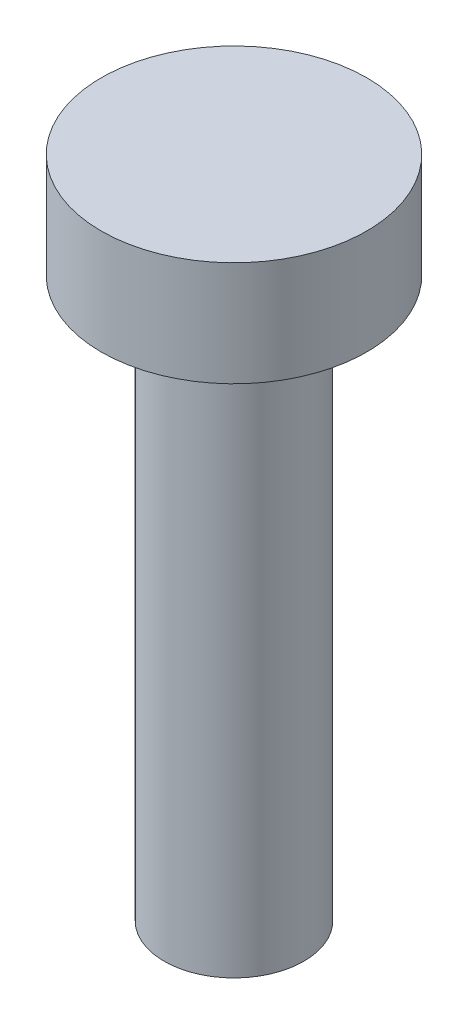
ISO-10303-21;
HEADER;
FILE_DESCRIPTION(('STEP AP214'),'2;1');
FILE_NAME('part.step','',(''),(''),'','','');
FILE_SCHEMA(('AUTOMOTIVE_DESIGN { 1 0 10303 214 1 1 1 1 }'));
ENDSEC;
DATA;
#1=APPLICATION_CONTEXT('core data for automotive mechanical design processes');
#2=APPLICATION_PROTOCOL_DEFINITION('international standard','automotive_design',2000,#1);
#3=PRODUCT_CONTEXT('',#1,'mechanical');
#4=PRODUCT('Part','Part','',(#3));
#5=PRODUCT_RELATED_PRODUCT_CATEGORY('part','',(#4));
#6=PRODUCT_DEFINITION_FORMATION('','',#4);
#7=PRODUCT_DEFINITION_CONTEXT('part definition',#1,'design');
#8=PRODUCT_DEFINITION('design','',#6,#7);
#9=PRODUCT_DEFINITION_SHAPE('','',#8);
#10=(LENGTH_UNIT() NAMED_UNIT(*) SI_UNIT(.MILLI.,.METRE.));
#11=(NAMED_UNIT(*) PLANE_ANGLE_UNIT() SI_UNIT($,.RADIAN.));
#12=(NAMED_UNIT(*) SI_UNIT($,.STERADIAN.) SOLID_ANGLE_UNIT());
#13=UNCERTAINTY_MEASURE_WITH_UNIT(LENGTH_MEASURE(1.E-05),#10,'distance_accuracy_value','');
#14=(GEOMETRIC_REPRESENTATION_CONTEXT(3) GLOBAL_UNCERTAINTY_ASSIGNED_CONTEXT((#13)) GLOBAL_UNIT_ASSIGNED_CONTEXT((#10,
#11,#12)) REPRESENTATION_CONTEXT('',''));
#15=CARTESIAN_POINT('',(0.,0.,0.));
#16=DIRECTION('',(0.,0.,1.));
#17=DIRECTION('',(1.,0.,0.));
#18=AXIS2_PLACEMENT_3D('',#15,#16,#17);
#19=CARTESIAN_POINT('',(117.,149.,-159.));
#20=DIRECTION('',(0.,-1.,0.));
#21=DIRECTION('',(0.,0.,1.));
#22=AXIS2_PLACEMENT_3D('',#19,#20,#21);
#23=PLANE('',#22);
#24=CARTESIAN_POINT('',(117.,149.,-159.));
#25=DIRECTION('',(0.,-1.,0.));
#26=DIRECTION('',(0.,0.,-1.));
#27=AXIS2_PLACEMENT_3D('',#24,#25,#26);
#28=CIRCLE('',#27,5.);
#29=CARTESIAN_POINT('',(117.,149.,-164.));
#30=VERTEX_POINT('',#29);
#31=EDGE_CURVE('E10',#30,#30,#28,.T.);
#32=ORIENTED_EDGE('',*,*,#31,.F.);
#33=EDGE_LOOP('',(#32));
#34=FACE_BOUND('',#33,.T.);
#35=CARTESIAN_POINT('',(117.,149.,-159.));
#36=DIRECTION('',(0.,1.,0.));
#37=DIRECTION('',(0.,0.,-1.));
#38=AXIS2_PLACEMENT_3D('',#35,#36,#37);
#39=CIRCLE('',#38,9.5);
#40=CARTESIAN_POINT('',(117.,149.,-168.5));
#41=VERTEX_POINT('',#40);
#42=EDGE_CURVE('E33',#41,#41,#39,.T.);
#43=ORIENTED_EDGE('',*,*,#42,.F.);
#44=EDGE_LOOP('',(#43));
#45=FACE_BOUND('',#44,.T.);
#46=ADVANCED_FACE('F15',(#34,#45),#23,.T.);
#47=CARTESIAN_POINT('',(117.,106.625,-159.));
#48=DIRECTION('',(0.,1.,0.));
#49=DIRECTION('',(0.,0.,1.));
#50=AXIS2_PLACEMENT_3D('',#47,#48,#49);
#51=CYLINDRICAL_SURFACE('',#50,9.5);
#52=CARTESIAN_POINT('',(117.,156.5,-159.));
#53=DIRECTION('',(0.,1.,0.));
#54=DIRECTION('',(0.,0.,-1.));
#55=AXIS2_PLACEMENT_3D('',#52,#53,#54);
#56=CIRCLE('',#55,9.5);
#57=CARTESIAN_POINT('',(117.,156.5,-168.5));
#58=VERTEX_POINT('',#57);
#59=EDGE_CURVE('E40',#58,#58,#56,.T.);
#60=ORIENTED_EDGE('',*,*,#59,.F.);
#61=EDGE_LOOP('',(#60));
#62=FACE_BOUND('',#61,.T.);
#63=ORIENTED_EDGE('',*,*,#42,.T.);
#64=EDGE_LOOP('',(#63));
#65=FACE_BOUND('',#64,.T.);
#66=ADVANCED_FACE('F48',(#62,#65),#51,.T.);
#67=CARTESIAN_POINT('',(117.,156.5,-159.));
#68=DIRECTION('',(0.,1.,0.));
#69=DIRECTION('',(0.,0.,1.));
#70=AXIS2_PLACEMENT_3D('',#67,#68,#69);
#71=PLANE('',#70);
#72=ORIENTED_EDGE('',*,*,#59,.T.);
#73=EDGE_LOOP('',(#72));
#74=FACE_BOUND('',#73,.T.);
#75=ADVANCED_FACE('F46',(#74),#71,.T.);
#76=CARTESIAN_POINT('',(117.,109.,-159.));
#77=DIRECTION('',(0.,-1.,0.));
#78=DIRECTION('',(0.,0.,1.));
#79=AXIS2_PLACEMENT_3D('',#76,#77,#78);
#80=PLANE('',#79);
#81=CARTESIAN_POINT('',(117.,109.,-159.));
#82=DIRECTION('',(0.,-1.,0.));
#83=DIRECTION('',(0.,0.,-1.));
#84=AXIS2_PLACEMENT_3D('',#81,#82,#83);
#85=CIRCLE('',#84,5.);
#86=CARTESIAN_POINT('',(117.,109.,-164.));
#87=VERTEX_POINT('',#86);
#88=EDGE_CURVE('E23',#87,#87,#85,.T.);
#89=ORIENTED_EDGE('',*,*,#88,.T.);
#90=EDGE_LOOP('',(#89));
#91=FACE_BOUND('',#90,.T.);
#92=ADVANCED_FACE('F61',(#91),#80,.T.);
#93=CARTESIAN_POINT('',(117.,109.,-159.));
#94=DIRECTION('',(0.,-1.,0.));
#95=DIRECTION('',(0.,0.,1.));
#96=AXIS2_PLACEMENT_3D('',#93,#94,#95);
#97=CYLINDRICAL_SURFACE('',#96,5.);
#98=ORIENTED_EDGE('',*,*,#88,.F.);
#99=EDGE_LOOP('',(#98));
#100=FACE_BOUND('',#99,.T.);
#101=ORIENTED_EDGE('',*,*,#31,.T.);
#102=EDGE_LOOP('',(#101));
#103=FACE_BOUND('',#102,.T.);
#104=ADVANCED_FACE('F17',(#100,#103),#97,.T.);
#105=CLOSED_SHELL('',(#46,#66,#75,#92,#104));
#106=MANIFOLD_SOLID_BREP('B1',#105);
#107=ADVANCED_BREP_SHAPE_REPRESENTATION('',(#18,#106),#14);
#108=SHAPE_DEFINITION_REPRESENTATION(#9,#107);
ENDSEC;
END-ISO-10303-21;
